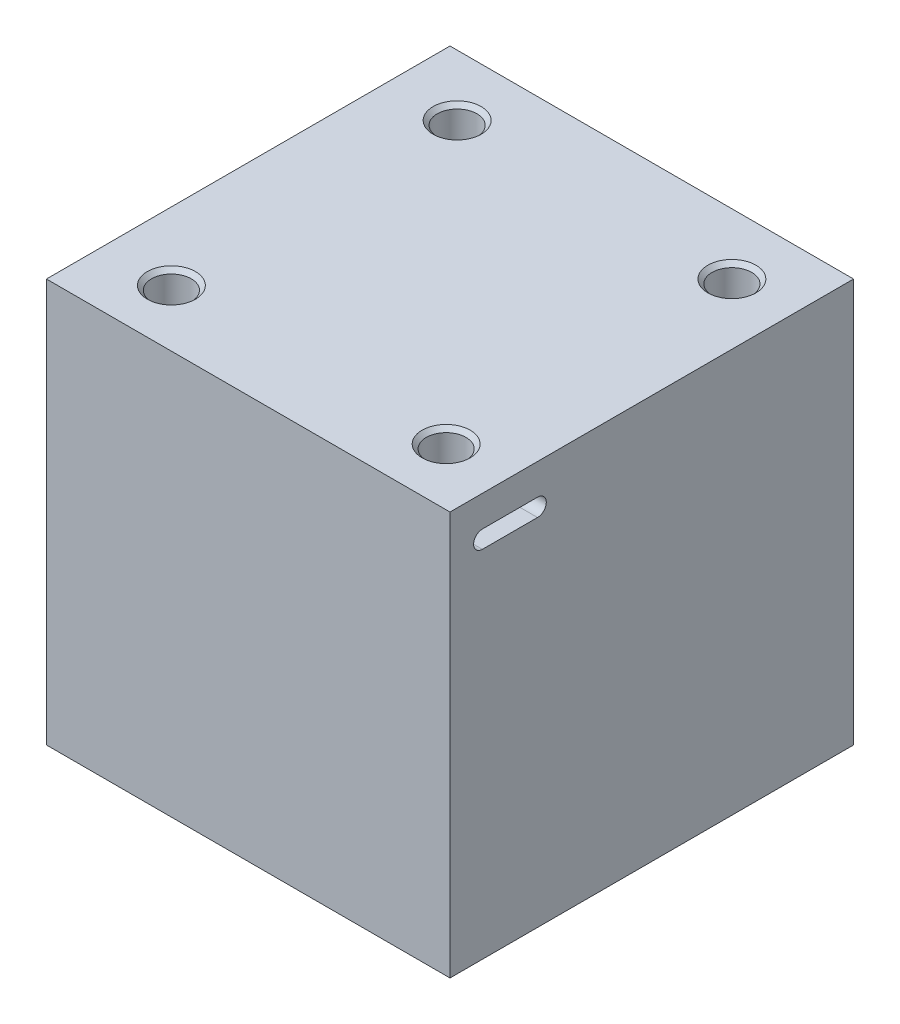
ISO-10303-21;
HEADER;
FILE_DESCRIPTION(('STEP AP214'),'2;1');
FILE_NAME('part.step','',(''),(''),'','','');
FILE_SCHEMA(('AUTOMOTIVE_DESIGN { 1 0 10303 214 1 1 1 1 }'));
ENDSEC;
DATA;
#1=APPLICATION_CONTEXT('core data for automotive mechanical design processes');
#2=APPLICATION_PROTOCOL_DEFINITION('international standard','automotive_design',2000,#1);
#3=PRODUCT_CONTEXT('',#1,'mechanical');
#4=PRODUCT('Part','Part','',(#3));
#5=PRODUCT_RELATED_PRODUCT_CATEGORY('part','',(#4));
#6=PRODUCT_DEFINITION_FORMATION('','',#4);
#7=PRODUCT_DEFINITION_CONTEXT('part definition',#1,'design');
#8=PRODUCT_DEFINITION('design','',#6,#7);
#9=PRODUCT_DEFINITION_SHAPE('','',#8);
#10=(LENGTH_UNIT() NAMED_UNIT(*) SI_UNIT(.MILLI.,.METRE.));
#11=(NAMED_UNIT(*) PLANE_ANGLE_UNIT() SI_UNIT($,.RADIAN.));
#12=(NAMED_UNIT(*) SI_UNIT($,.STERADIAN.) SOLID_ANGLE_UNIT());
#13=UNCERTAINTY_MEASURE_WITH_UNIT(LENGTH_MEASURE(1.E-05),#10,'distance_accuracy_value','');
#14=(GEOMETRIC_REPRESENTATION_CONTEXT(3) GLOBAL_UNCERTAINTY_ASSIGNED_CONTEXT((#13)) GLOBAL_UNIT_ASSIGNED_CONTEXT((#10,
#11,#12)) REPRESENTATION_CONTEXT('',''));
#15=CARTESIAN_POINT('',(0.,0.,0.));
#16=DIRECTION('',(0.,0.,1.));
#17=DIRECTION('',(1.,0.,0.));
#18=AXIS2_PLACEMENT_3D('',#15,#16,#17);
#19=CARTESIAN_POINT('',(-42.2382238853841,50.8,43.6324444897448));
#20=DIRECTION('',(0.,1.,0.));
#21=DIRECTION('',(0.,0.,1.));
#22=AXIS2_PLACEMENT_3D('',#19,#20,#21);
#23=CYLINDRICAL_SURFACE('',#22,2.49999999999999);
#24=CARTESIAN_POINT('',(-42.2382238853841,46.9066280030771,43.6324444897448));
#25=DIRECTION('',(0.,1.,0.));
#26=DIRECTION('',(0.,0.,1.));
#27=AXIS2_PLACEMENT_3D('',#24,#25,#26);
#28=CIRCLE('',#27,2.49999999999999);
#29=CARTESIAN_POINT('',(-42.2382238853841,46.9066280030771,46.1324444897448));
#30=VERTEX_POINT('',#29);
#31=EDGE_CURVE('E154',#30,#30,#28,.T.);
#32=ORIENTED_EDGE('',*,*,#31,.F.);
#33=EDGE_LOOP('',(#32));
#34=FACE_BOUND('',#33,.T.);
#35=CARTESIAN_POINT('',(-42.2382238853841,50.275,43.6324444897448));
#36=DIRECTION('',(0.,1.,0.));
#37=DIRECTION('',(0.,0.,1.));
#38=AXIS2_PLACEMENT_3D('',#35,#36,#37);
#39=CIRCLE('',#38,2.49999999999999);
#40=CARTESIAN_POINT('',(-42.2382238853841,50.275,46.1324444897448));
#41=VERTEX_POINT('',#40);
#42=EDGE_CURVE('E181',#41,#41,#39,.T.);
#43=ORIENTED_EDGE('',*,*,#42,.T.);
#44=EDGE_LOOP('',(#43));
#45=FACE_BOUND('',#44,.T.);
#46=ADVANCED_FACE('F41',(#34,#45),#23,.F.);
#47=CARTESIAN_POINT('',(-7.65257367586586,50.8,43.6324444897448));
#48=DIRECTION('',(0.,1.,0.));
#49=DIRECTION('',(0.,0.,1.));
#50=AXIS2_PLACEMENT_3D('',#47,#48,#49);
#51=CYLINDRICAL_SURFACE('',#50,2.49999999999999);
#52=CARTESIAN_POINT('',(-7.65257367586586,46.9066280030771,43.6324444897448));
#53=DIRECTION('',(0.,1.,0.));
#54=DIRECTION('',(0.,0.,1.));
#55=AXIS2_PLACEMENT_3D('',#52,#53,#54);
#56=CIRCLE('',#55,2.49999999999999);
#57=CARTESIAN_POINT('',(-7.65257367586586,46.9066280030771,46.1324444897448));
#58=VERTEX_POINT('',#57);
#59=EDGE_CURVE('E121',#58,#58,#56,.T.);
#60=ORIENTED_EDGE('',*,*,#59,.F.);
#61=EDGE_LOOP('',(#60));
#62=FACE_BOUND('',#61,.T.);
#63=CARTESIAN_POINT('',(-7.65257367586586,50.275,43.6324444897448));
#64=DIRECTION('',(0.,1.,0.));
#65=DIRECTION('',(0.,0.,1.));
#66=AXIS2_PLACEMENT_3D('',#63,#64,#65);
#67=CIRCLE('',#66,2.49999999999999);
#68=CARTESIAN_POINT('',(-7.65257367586586,50.275,46.1324444897448));
#69=VERTEX_POINT('',#68);
#70=EDGE_CURVE('E172',#69,#69,#67,.T.);
#71=ORIENTED_EDGE('',*,*,#70,.T.);
#72=EDGE_LOOP('',(#71));
#73=FACE_BOUND('',#72,.T.);
#74=ADVANCED_FACE('F237',(#62,#73),#51,.F.);
#75=CARTESIAN_POINT('',(0.,0.,50.8));
#76=DIRECTION('',(-1.,0.,0.));
#77=DIRECTION('',(0.,0.,1.));
#78=AXIS2_PLACEMENT_3D('',#75,#76,#77);
#79=PLANE('',#78);
#80=CARTESIAN_POINT('',(0.,45.8,46.7210328592849));
#81=DIRECTION('',(1.,0.,0.));
#82=DIRECTION('',(0.,0.,-1.));
#83=AXIS2_PLACEMENT_3D('',#80,#81,#82);
#84=CIRCLE('',#83,1.10662800307708);
#85=CARTESIAN_POINT('',(0.,46.9066280030771,46.7210328592849));
#86=VERTEX_POINT('',#85);
#87=CARTESIAN_POINT('',(0.,44.6933719969229,46.7210328592849));
#88=VERTEX_POINT('',#87);
#89=EDGE_CURVE('E56',#86,#88,#84,.T.);
#90=ORIENTED_EDGE('',*,*,#89,.F.);
#91=DIRECTION('',(0.,0.,1.));
#92=VECTOR('',#91,1.);
#93=CARTESIAN_POINT('',(0.,46.9066280030771,46.7210328592849));
#94=LINE('',#93,#92);
#95=CARTESIAN_POINT('',(0.,46.9066280030771,39.786164040002));
#96=VERTEX_POINT('',#95);
#97=EDGE_CURVE('E114',#96,#86,#94,.T.);
#98=ORIENTED_EDGE('',*,*,#97,.F.);
#99=CARTESIAN_POINT('',(0.,45.8,39.786164040002));
#100=DIRECTION('',(1.,0.,0.));
#101=DIRECTION('',(0.,0.,-1.));
#102=AXIS2_PLACEMENT_3D('',#99,#100,#101);
#103=CIRCLE('',#102,1.10662800307708);
#104=CARTESIAN_POINT('',(0.,44.6933719969229,39.786164040002));
#105=VERTEX_POINT('',#104);
#106=EDGE_CURVE('E135',#105,#96,#103,.T.);
#107=ORIENTED_EDGE('',*,*,#106,.F.);
#108=DIRECTION('',(0.,0.,-1.));
#109=VECTOR('',#108,1.);
#110=CARTESIAN_POINT('',(0.,44.6933719969229,46.7210328592849));
#111=LINE('',#110,#109);
#112=EDGE_CURVE('E129',#88,#105,#111,.T.);
#113=ORIENTED_EDGE('',*,*,#112,.F.);
#114=EDGE_LOOP('',(#90,#98,#107,#113));
#115=FACE_BOUND('',#114,.T.);
#116=DIRECTION('',(0.,1.,0.));
#117=VECTOR('',#116,1.);
#118=CARTESIAN_POINT('',(0.,0.,0.));
#119=LINE('',#118,#117);
#120=CARTESIAN_POINT('',(0.,0.,0.));
#121=VERTEX_POINT('',#120);
#122=CARTESIAN_POINT('',(0.,50.8,0.));
#123=VERTEX_POINT('',#122);
#124=EDGE_CURVE('E187',#121,#123,#119,.T.);
#125=ORIENTED_EDGE('',*,*,#124,.T.);
#126=DIRECTION('',(0.,0.,-1.));
#127=VECTOR('',#126,1.);
#128=CARTESIAN_POINT('',(0.,50.8,50.8));
#129=LINE('',#128,#127);
#130=CARTESIAN_POINT('',(0.,50.8,50.8));
#131=VERTEX_POINT('',#130);
#132=EDGE_CURVE('E11',#131,#123,#129,.T.);
#133=ORIENTED_EDGE('',*,*,#132,.F.);
#134=DIRECTION('',(0.,1.,0.));
#135=VECTOR('',#134,1.);
#136=CARTESIAN_POINT('',(0.,0.,50.8));
#137=LINE('',#136,#135);
#138=CARTESIAN_POINT('',(0.,0.,50.8));
#139=VERTEX_POINT('',#138);
#140=EDGE_CURVE('E188',#139,#131,#137,.T.);
#141=ORIENTED_EDGE('',*,*,#140,.F.);
#142=DIRECTION('',(0.,0.,-1.));
#143=VECTOR('',#142,1.);
#144=CARTESIAN_POINT('',(0.,0.,50.8));
#145=LINE('',#144,#143);
#146=EDGE_CURVE('E198',#139,#121,#145,.T.);
#147=ORIENTED_EDGE('',*,*,#146,.T.);
#148=EDGE_LOOP('',(#125,#133,#141,#147));
#149=FACE_BOUND('',#148,.T.);
#150=ADVANCED_FACE('F43',(#115,#149),#79,.F.);
#151=CARTESIAN_POINT('',(0.,50.8,50.8));
#152=DIRECTION('',(0.,-1.,0.));
#153=DIRECTION('',(1.,0.,0.));
#154=AXIS2_PLACEMENT_3D('',#151,#152,#153);
#155=PLANE('',#154);
#156=CARTESIAN_POINT('',(-42.2382238853841,50.8,7.66336827184591));
#157=DIRECTION('',(0.,1.,0.));
#158=DIRECTION('',(0.,0.,1.));
#159=AXIS2_PLACEMENT_3D('',#156,#157,#158);
#160=CIRCLE('',#159,3.025);
#161=CARTESIAN_POINT('',(-42.2382238853841,50.8,10.6883682718459));
#162=VERTEX_POINT('',#161);
#163=EDGE_CURVE('E150',#162,#162,#160,.T.);
#164=ORIENTED_EDGE('',*,*,#163,.F.);
#165=EDGE_LOOP('',(#164));
#166=FACE_BOUND('',#165,.T.);
#167=CARTESIAN_POINT('',(-7.65257367586586,50.8,7.66336827184591));
#168=DIRECTION('',(0.,1.,0.));
#169=DIRECTION('',(0.,0.,1.));
#170=AXIS2_PLACEMENT_3D('',#167,#168,#169);
#171=CIRCLE('',#170,3.025);
#172=CARTESIAN_POINT('',(-7.65257367586586,50.8,10.6883682718459));
#173=VERTEX_POINT('',#172);
#174=EDGE_CURVE('E160',#173,#173,#171,.T.);
#175=ORIENTED_EDGE('',*,*,#174,.F.);
#176=EDGE_LOOP('',(#175));
#177=FACE_BOUND('',#176,.T.);
#178=CARTESIAN_POINT('',(-7.65257367586586,50.8,43.6324444897448));
#179=DIRECTION('',(0.,1.,0.));
#180=DIRECTION('',(0.,0.,1.));
#181=AXIS2_PLACEMENT_3D('',#178,#179,#180);
#182=CIRCLE('',#181,3.025);
#183=CARTESIAN_POINT('',(-7.65257367586586,50.8,46.6574444897448));
#184=VERTEX_POINT('',#183);
#185=EDGE_CURVE('E169',#184,#184,#182,.T.);
#186=ORIENTED_EDGE('',*,*,#185,.F.);
#187=EDGE_LOOP('',(#186));
#188=FACE_BOUND('',#187,.T.);
#189=CARTESIAN_POINT('',(-42.2382238853841,50.8,43.6324444897448));
#190=DIRECTION('',(0.,1.,0.));
#191=DIRECTION('',(0.,0.,1.));
#192=AXIS2_PLACEMENT_3D('',#189,#190,#191);
#193=CIRCLE('',#192,3.025);
#194=CARTESIAN_POINT('',(-42.2382238853841,50.8,46.6574444897448));
#195=VERTEX_POINT('',#194);
#196=EDGE_CURVE('E178',#195,#195,#193,.T.);
#197=ORIENTED_EDGE('',*,*,#196,.F.);
#198=EDGE_LOOP('',(#197));
#199=FACE_BOUND('',#198,.T.);
#200=DIRECTION('',(-1.,0.,0.));
#201=VECTOR('',#200,1.);
#202=CARTESIAN_POINT('',(0.,50.8,0.));
#203=LINE('',#202,#201);
#204=CARTESIAN_POINT('',(-50.8,50.8,0.));
#205=VERTEX_POINT('',#204);
#206=EDGE_CURVE('E201',#123,#205,#203,.T.);
#207=ORIENTED_EDGE('',*,*,#206,.T.);
#208=DIRECTION('',(0.,0.,-1.));
#209=VECTOR('',#208,1.);
#210=CARTESIAN_POINT('',(-50.8,50.8,50.8));
#211=LINE('',#210,#209);
#212=CARTESIAN_POINT('',(-50.8,50.8,50.8));
#213=VERTEX_POINT('',#212);
#214=EDGE_CURVE('E49',#213,#205,#211,.T.);
#215=ORIENTED_EDGE('',*,*,#214,.F.);
#216=DIRECTION('',(-1.,0.,0.));
#217=VECTOR('',#216,1.);
#218=CARTESIAN_POINT('',(0.,50.8,50.8));
#219=LINE('',#218,#217);
#220=EDGE_CURVE('E191',#131,#213,#219,.T.);
#221=ORIENTED_EDGE('',*,*,#220,.F.);
#222=ORIENTED_EDGE('',*,*,#132,.T.);
#223=EDGE_LOOP('',(#207,#215,#221,#222));
#224=FACE_BOUND('',#223,.T.);
#225=ADVANCED_FACE('F229',(#166,#177,#188,#199,#224),#155,.F.);
#226=CARTESIAN_POINT('',(-50.8,0.,50.8));
#227=DIRECTION('',(1.,0.,0.));
#228=DIRECTION('',(0.,0.,-1.));
#229=AXIS2_PLACEMENT_3D('',#226,#227,#228);
#230=PLANE('',#229);
#231=CARTESIAN_POINT('',(-50.8,45.8,39.786164040002));
#232=DIRECTION('',(1.,0.,0.));
#233=DIRECTION('',(0.,0.,-1.));
#234=AXIS2_PLACEMENT_3D('',#231,#232,#233);
#235=CIRCLE('',#234,1.10662800307708);
#236=CARTESIAN_POINT('',(-50.8,46.9066280030771,39.786164040002));
#237=VERTEX_POINT('',#236);
#238=CARTESIAN_POINT('',(-50.8,44.6933719969229,39.786164040002));
#239=VERTEX_POINT('',#238);
#240=EDGE_CURVE('E64',#237,#239,#235,.F.);
#241=ORIENTED_EDGE('',*,*,#240,.F.);
#242=DIRECTION('',(0.,0.,-1.));
#243=VECTOR('',#242,1.);
#244=CARTESIAN_POINT('',(-50.8,46.9066280030771,46.7210328592849));
#245=LINE('',#244,#243);
#246=CARTESIAN_POINT('',(-50.8,46.9066280030771,46.7210328592849));
#247=VERTEX_POINT('',#246);
#248=EDGE_CURVE('E127',#247,#237,#245,.T.);
#249=ORIENTED_EDGE('',*,*,#248,.F.);
#250=CARTESIAN_POINT('',(-50.8,45.8,46.7210328592849));
#251=DIRECTION('',(1.,0.,0.));
#252=DIRECTION('',(0.,0.,-1.));
#253=AXIS2_PLACEMENT_3D('',#250,#251,#252);
#254=CIRCLE('',#253,1.10662800307708);
#255=CARTESIAN_POINT('',(-50.8,44.6933719969229,46.7210328592849));
#256=VERTEX_POINT('',#255);
#257=EDGE_CURVE('E108',#256,#247,#254,.F.);
#258=ORIENTED_EDGE('',*,*,#257,.F.);
#259=DIRECTION('',(0.,0.,1.));
#260=VECTOR('',#259,1.);
#261=CARTESIAN_POINT('',(-50.8,44.6933719969229,46.7210328592849));
#262=LINE('',#261,#260);
#263=EDGE_CURVE('E117',#239,#256,#262,.T.);
#264=ORIENTED_EDGE('',*,*,#263,.F.);
#265=EDGE_LOOP('',(#241,#249,#258,#264));
#266=FACE_BOUND('',#265,.T.);
#267=DIRECTION('',(0.,-1.,0.));
#268=VECTOR('',#267,1.);
#269=CARTESIAN_POINT('',(-50.8,0.,0.));
#270=LINE('',#269,#268);
#271=CARTESIAN_POINT('',(-50.8,0.,0.));
#272=VERTEX_POINT('',#271);
#273=EDGE_CURVE('E203',#205,#272,#270,.T.);
#274=ORIENTED_EDGE('',*,*,#273,.T.);
#275=DIRECTION('',(0.,0.,-1.));
#276=VECTOR('',#275,1.);
#277=CARTESIAN_POINT('',(-50.8,0.,50.8));
#278=LINE('',#277,#276);
#279=CARTESIAN_POINT('',(-50.8,0.,50.8));
#280=VERTEX_POINT('',#279);
#281=EDGE_CURVE('E208',#280,#272,#278,.T.);
#282=ORIENTED_EDGE('',*,*,#281,.F.);
#283=DIRECTION('',(0.,-1.,0.));
#284=VECTOR('',#283,1.);
#285=CARTESIAN_POINT('',(-50.8,0.,50.8));
#286=LINE('',#285,#284);
#287=EDGE_CURVE('E194',#213,#280,#286,.T.);
#288=ORIENTED_EDGE('',*,*,#287,.F.);
#289=ORIENTED_EDGE('',*,*,#214,.T.);
#290=EDGE_LOOP('',(#274,#282,#288,#289));
#291=FACE_BOUND('',#290,.T.);
#292=ADVANCED_FACE('F124',(#266,#291),#230,.F.);
#293=CARTESIAN_POINT('',(0.,0.,50.8));
#294=DIRECTION('',(0.,1.,0.));
#295=DIRECTION('',(-1.,0.,0.));
#296=AXIS2_PLACEMENT_3D('',#293,#294,#295);
#297=PLANE('',#296);
#298=CARTESIAN_POINT('',(-42.2382238853841,0.,7.66336827184591));
#299=DIRECTION('',(0.,1.,0.));
#300=DIRECTION('',(0.,0.,1.));
#301=AXIS2_PLACEMENT_3D('',#298,#299,#300);
#302=CIRCLE('',#301,2.5);
#303=CARTESIAN_POINT('',(-42.2382238853841,0.,10.1633682718459));
#304=VERTEX_POINT('',#303);
#305=EDGE_CURVE('E157',#304,#304,#302,.T.);
#306=ORIENTED_EDGE('',*,*,#305,.T.);
#307=EDGE_LOOP('',(#306));
#308=FACE_BOUND('',#307,.T.);
#309=CARTESIAN_POINT('',(-7.65257367586586,0.,7.66336827184591));
#310=DIRECTION('',(0.,1.,0.));
#311=DIRECTION('',(0.,0.,1.));
#312=AXIS2_PLACEMENT_3D('',#309,#310,#311);
#313=CIRCLE('',#312,2.49999999999999);
#314=CARTESIAN_POINT('',(-7.65257367586586,0.,10.1633682718459));
#315=VERTEX_POINT('',#314);
#316=EDGE_CURVE('E166',#315,#315,#313,.T.);
#317=ORIENTED_EDGE('',*,*,#316,.T.);
#318=EDGE_LOOP('',(#317));
#319=FACE_BOUND('',#318,.T.);
#320=CARTESIAN_POINT('',(-7.65257367586586,0.,43.6324444897448));
#321=DIRECTION('',(0.,1.,0.));
#322=DIRECTION('',(0.,0.,1.));
#323=AXIS2_PLACEMENT_3D('',#320,#321,#322);
#324=CIRCLE('',#323,2.49999999999999);
#325=CARTESIAN_POINT('',(-7.65257367586586,0.,46.1324444897448));
#326=VERTEX_POINT('',#325);
#327=EDGE_CURVE('E175',#326,#326,#324,.T.);
#328=ORIENTED_EDGE('',*,*,#327,.T.);
#329=EDGE_LOOP('',(#328));
#330=FACE_BOUND('',#329,.T.);
#331=CARTESIAN_POINT('',(-42.2382238853841,0.,43.6324444897448));
#332=DIRECTION('',(0.,1.,0.));
#333=DIRECTION('',(0.,0.,1.));
#334=AXIS2_PLACEMENT_3D('',#331,#332,#333);
#335=CIRCLE('',#334,2.5);
#336=CARTESIAN_POINT('',(-42.2382238853841,0.,46.1324444897448));
#337=VERTEX_POINT('',#336);
#338=EDGE_CURVE('E184',#337,#337,#335,.T.);
#339=ORIENTED_EDGE('',*,*,#338,.T.);
#340=EDGE_LOOP('',(#339));
#341=FACE_BOUND('',#340,.T.);
#342=DIRECTION('',(1.,0.,0.));
#343=VECTOR('',#342,1.);
#344=CARTESIAN_POINT('',(0.,0.,0.));
#345=LINE('',#344,#343);
#346=EDGE_CURVE('E192',#272,#121,#345,.T.);
#347=ORIENTED_EDGE('',*,*,#346,.T.);
#348=ORIENTED_EDGE('',*,*,#146,.F.);
#349=DIRECTION('',(1.,0.,0.));
#350=VECTOR('',#349,1.);
#351=CARTESIAN_POINT('',(0.,0.,50.8));
#352=LINE('',#351,#350);
#353=EDGE_CURVE('E196',#280,#139,#352,.T.);
#354=ORIENTED_EDGE('',*,*,#353,.F.);
#355=ORIENTED_EDGE('',*,*,#281,.T.);
#356=EDGE_LOOP('',(#347,#348,#354,#355));
#357=FACE_BOUND('',#356,.T.);
#358=ADVANCED_FACE('F222',(#308,#319,#330,#341,#357),#297,.F.);
#359=CARTESIAN_POINT('',(0.,0.,50.8));
#360=DIRECTION('',(0.,0.,1.));
#361=DIRECTION('',(1.,0.,0.));
#362=AXIS2_PLACEMENT_3D('',#359,#360,#361);
#363=PLANE('',#362);
#364=ORIENTED_EDGE('',*,*,#140,.T.);
#365=ORIENTED_EDGE('',*,*,#220,.T.);
#366=ORIENTED_EDGE('',*,*,#287,.T.);
#367=ORIENTED_EDGE('',*,*,#353,.T.);
#368=EDGE_LOOP('',(#364,#365,#366,#367));
#369=FACE_BOUND('',#368,.T.);
#370=ADVANCED_FACE('F228',(#369),#363,.T.);
#371=CARTESIAN_POINT('',(0.,0.,0.));
#372=DIRECTION('',(0.,0.,1.));
#373=DIRECTION('',(1.,0.,0.));
#374=AXIS2_PLACEMENT_3D('',#371,#372,#373);
#375=PLANE('',#374);
#376=ORIENTED_EDGE('',*,*,#124,.F.);
#377=ORIENTED_EDGE('',*,*,#346,.F.);
#378=ORIENTED_EDGE('',*,*,#273,.F.);
#379=ORIENTED_EDGE('',*,*,#206,.F.);
#380=EDGE_LOOP('',(#376,#377,#378,#379));
#381=FACE_BOUND('',#380,.T.);
#382=ADVANCED_FACE('F219',(#381),#375,.F.);
#383=CARTESIAN_POINT('',(-42.2382238853841,44.6933719969229,43.6324444897448));
#384=DIRECTION('',(0.,-1.,0.));
#385=DIRECTION('',(0.,0.,-1.));
#386=AXIS2_PLACEMENT_3D('',#383,#384,#385);
#387=CIRCLE('',#386,2.49999999999999);
#388=CARTESIAN_POINT('',(-42.2382238853841,44.6933719969229,41.1324444897448));
#389=VERTEX_POINT('',#388);
#390=EDGE_CURVE('E122',#389,#389,#387,.T.);
#391=ORIENTED_EDGE('',*,*,#390,.F.);
#392=EDGE_LOOP('',(#391));
#393=FACE_BOUND('',#392,.T.);
#394=ORIENTED_EDGE('',*,*,#338,.F.);
#395=EDGE_LOOP('',(#394));
#396=FACE_BOUND('',#395,.T.);
#397=ADVANCED_FACE('F244',(#393,#396),#23,.F.);
#398=CARTESIAN_POINT('',(-42.2382238853841,50.8,43.6324444897448));
#399=DIRECTION('',(0.,1.,0.));
#400=DIRECTION('',(0.,0.,1.));
#401=AXIS2_PLACEMENT_3D('',#398,#399,#400);
#402=CONICAL_SURFACE('',#401,3.025,0.785398163397435);
#403=ORIENTED_EDGE('',*,*,#42,.F.);
#404=EDGE_LOOP('',(#403));
#405=FACE_BOUND('',#404,.T.);
#406=ORIENTED_EDGE('',*,*,#196,.T.);
#407=EDGE_LOOP('',(#406));
#408=FACE_BOUND('',#407,.T.);
#409=ADVANCED_FACE('F256',(#405,#408),#402,.F.);
#410=CARTESIAN_POINT('',(-7.65257367586586,44.6933719969229,43.6324444897448));
#411=DIRECTION('',(0.,-1.,0.));
#412=DIRECTION('',(0.,0.,-1.));
#413=AXIS2_PLACEMENT_3D('',#410,#411,#412);
#414=CIRCLE('',#413,2.49999999999999);
#415=CARTESIAN_POINT('',(-7.65257367586586,44.6933719969229,41.1324444897448));
#416=VERTEX_POINT('',#415);
#417=EDGE_CURVE('E142',#416,#416,#414,.T.);
#418=ORIENTED_EDGE('',*,*,#417,.F.);
#419=EDGE_LOOP('',(#418));
#420=FACE_BOUND('',#419,.T.);
#421=ORIENTED_EDGE('',*,*,#327,.F.);
#422=EDGE_LOOP('',(#421));
#423=FACE_BOUND('',#422,.T.);
#424=ADVANCED_FACE('F250',(#420,#423),#51,.F.);
#425=CARTESIAN_POINT('',(-7.65257367586586,50.8,43.6324444897448));
#426=DIRECTION('',(0.,1.,0.));
#427=DIRECTION('',(0.,0.,1.));
#428=AXIS2_PLACEMENT_3D('',#425,#426,#427);
#429=CONICAL_SURFACE('',#428,3.025,0.785398163397435);
#430=ORIENTED_EDGE('',*,*,#70,.F.);
#431=EDGE_LOOP('',(#430));
#432=FACE_BOUND('',#431,.T.);
#433=ORIENTED_EDGE('',*,*,#185,.T.);
#434=EDGE_LOOP('',(#433));
#435=FACE_BOUND('',#434,.T.);
#436=ADVANCED_FACE('F281',(#432,#435),#429,.F.);
#437=CARTESIAN_POINT('',(-7.65257367586586,50.8,7.66336827184591));
#438=DIRECTION('',(0.,1.,0.));
#439=DIRECTION('',(0.,0.,1.));
#440=AXIS2_PLACEMENT_3D('',#437,#438,#439);
#441=CYLINDRICAL_SURFACE('',#440,2.49999999999999);
#442=ORIENTED_EDGE('',*,*,#316,.F.);
#443=EDGE_LOOP('',(#442));
#444=FACE_BOUND('',#443,.T.);
#445=CARTESIAN_POINT('',(-7.65257367586586,50.275,7.66336827184591));
#446=DIRECTION('',(0.,1.,0.));
#447=DIRECTION('',(0.,0.,1.));
#448=AXIS2_PLACEMENT_3D('',#445,#446,#447);
#449=CIRCLE('',#448,2.49999999999999);
#450=CARTESIAN_POINT('',(-7.65257367586586,50.275,10.1633682718459));
#451=VERTEX_POINT('',#450);
#452=EDGE_CURVE('E163',#451,#451,#449,.T.);
#453=ORIENTED_EDGE('',*,*,#452,.T.);
#454=EDGE_LOOP('',(#453));
#455=FACE_BOUND('',#454,.T.);
#456=ADVANCED_FACE('F286',(#444,#455),#441,.F.);
#457=CARTESIAN_POINT('',(-7.65257367586586,50.8,7.66336827184591));
#458=DIRECTION('',(0.,1.,0.));
#459=DIRECTION('',(0.,0.,1.));
#460=AXIS2_PLACEMENT_3D('',#457,#458,#459);
#461=CONICAL_SURFACE('',#460,3.025,0.785398163397435);
#462=ORIENTED_EDGE('',*,*,#452,.F.);
#463=EDGE_LOOP('',(#462));
#464=FACE_BOUND('',#463,.T.);
#465=ORIENTED_EDGE('',*,*,#174,.T.);
#466=EDGE_LOOP('',(#465));
#467=FACE_BOUND('',#466,.T.);
#468=ADVANCED_FACE('F293',(#464,#467),#461,.F.);
#469=CARTESIAN_POINT('',(-42.2382238853841,50.8,7.66336827184591));
#470=DIRECTION('',(0.,1.,0.));
#471=DIRECTION('',(0.,0.,1.));
#472=AXIS2_PLACEMENT_3D('',#469,#470,#471);
#473=CYLINDRICAL_SURFACE('',#472,2.49999999999999);
#474=ORIENTED_EDGE('',*,*,#305,.F.);
#475=EDGE_LOOP('',(#474));
#476=FACE_BOUND('',#475,.T.);
#477=CARTESIAN_POINT('',(-42.2382238853841,50.275,7.66336827184591));
#478=DIRECTION('',(0.,1.,0.));
#479=DIRECTION('',(0.,0.,1.));
#480=AXIS2_PLACEMENT_3D('',#477,#478,#479);
#481=CIRCLE('',#480,2.49999999999999);
#482=CARTESIAN_POINT('',(-42.2382238853841,50.275,10.1633682718459));
#483=VERTEX_POINT('',#482);
#484=EDGE_CURVE('E153',#483,#483,#481,.T.);
#485=ORIENTED_EDGE('',*,*,#484,.T.);
#486=EDGE_LOOP('',(#485));
#487=FACE_BOUND('',#486,.T.);
#488=ADVANCED_FACE('F297',(#476,#487),#473,.F.);
#489=CARTESIAN_POINT('',(-42.2382238853841,50.8,7.66336827184591));
#490=DIRECTION('',(0.,1.,0.));
#491=DIRECTION('',(0.,0.,1.));
#492=AXIS2_PLACEMENT_3D('',#489,#490,#491);
#493=CONICAL_SURFACE('',#492,3.025,0.785398163397435);
#494=ORIENTED_EDGE('',*,*,#484,.F.);
#495=EDGE_LOOP('',(#494));
#496=FACE_BOUND('',#495,.T.);
#497=ORIENTED_EDGE('',*,*,#163,.T.);
#498=EDGE_LOOP('',(#497));
#499=FACE_BOUND('',#498,.T.);
#500=ADVANCED_FACE('F301',(#496,#499),#493,.F.);
#501=CARTESIAN_POINT('',(-50.801,45.8,46.7210328592849));
#502=DIRECTION('',(1.,0.,0.));
#503=DIRECTION('',(0.,0.,-1.));
#504=AXIS2_PLACEMENT_3D('',#501,#502,#503);
#505=CYLINDRICAL_SURFACE('',#504,1.10662800307708);
#506=ORIENTED_EDGE('',*,*,#257,.T.);
#507=DIRECTION('',(1.,0.,0.));
#508=VECTOR('',#507,1.);
#509=CARTESIAN_POINT('',(-50.801,46.9066280030771,46.7210328592849));
#510=LINE('',#509,#508);
#511=EDGE_CURVE('E140',#247,#86,#510,.T.);
#512=ORIENTED_EDGE('',*,*,#511,.T.);
#513=ORIENTED_EDGE('',*,*,#89,.T.);
#514=DIRECTION('',(1.,0.,0.));
#515=VECTOR('',#514,1.);
#516=CARTESIAN_POINT('',(-50.801,44.6933719969229,46.7210328592849));
#517=LINE('',#516,#515);
#518=EDGE_CURVE('E104',#256,#88,#517,.T.);
#519=ORIENTED_EDGE('',*,*,#518,.F.);
#520=EDGE_LOOP('',(#506,#512,#513,#519));
#521=FACE_BOUND('',#520,.T.);
#522=ADVANCED_FACE('F106',(#521),#505,.F.);
#523=CARTESIAN_POINT('',(-50.801,45.8,39.786164040002));
#524=DIRECTION('',(1.,0.,0.));
#525=DIRECTION('',(0.,0.,-1.));
#526=AXIS2_PLACEMENT_3D('',#523,#524,#525);
#527=CYLINDRICAL_SURFACE('',#526,1.10662800307708);
#528=ORIENTED_EDGE('',*,*,#240,.T.);
#529=DIRECTION('',(1.,0.,0.));
#530=VECTOR('',#529,1.);
#531=CARTESIAN_POINT('',(-50.801,44.6933719969229,39.786164040002));
#532=LINE('',#531,#530);
#533=EDGE_CURVE('E113',#239,#105,#532,.T.);
#534=ORIENTED_EDGE('',*,*,#533,.T.);
#535=ORIENTED_EDGE('',*,*,#106,.T.);
#536=DIRECTION('',(1.,0.,0.));
#537=VECTOR('',#536,1.);
#538=CARTESIAN_POINT('',(-50.801,46.9066280030771,39.786164040002));
#539=LINE('',#538,#537);
#540=EDGE_CURVE('E143',#237,#96,#539,.T.);
#541=ORIENTED_EDGE('',*,*,#540,.F.);
#542=EDGE_LOOP('',(#528,#534,#535,#541));
#543=FACE_BOUND('',#542,.T.);
#544=ADVANCED_FACE('F308',(#543),#527,.F.);
#545=CARTESIAN_POINT('',(-50.801,46.9066280030771,46.7210328592849));
#546=DIRECTION('',(0.,1.,0.));
#547=DIRECTION('',(0.,0.,1.));
#548=AXIS2_PLACEMENT_3D('',#545,#546,#547);
#549=PLANE('',#548);
#550=ORIENTED_EDGE('',*,*,#248,.T.);
#551=ORIENTED_EDGE('',*,*,#540,.T.);
#552=ORIENTED_EDGE('',*,*,#97,.T.);
#553=ORIENTED_EDGE('',*,*,#511,.F.);
#554=EDGE_LOOP('',(#550,#551,#552,#553));
#555=FACE_BOUND('',#554,.T.);
#556=ORIENTED_EDGE('',*,*,#31,.T.);
#557=EDGE_LOOP('',(#556));
#558=FACE_BOUND('',#557,.T.);
#559=ORIENTED_EDGE('',*,*,#59,.T.);
#560=EDGE_LOOP('',(#559));
#561=FACE_BOUND('',#560,.T.);
#562=ADVANCED_FACE('F311',(#555,#558,#561),#549,.F.);
#563=CARTESIAN_POINT('',(-50.801,44.6933719969229,46.7210328592849));
#564=DIRECTION('',(0.,-1.,0.));
#565=DIRECTION('',(0.,0.,-1.));
#566=AXIS2_PLACEMENT_3D('',#563,#564,#565);
#567=PLANE('',#566);
#568=ORIENTED_EDGE('',*,*,#263,.T.);
#569=ORIENTED_EDGE('',*,*,#518,.T.);
#570=ORIENTED_EDGE('',*,*,#112,.T.);
#571=ORIENTED_EDGE('',*,*,#533,.F.);
#572=EDGE_LOOP('',(#568,#569,#570,#571));
#573=FACE_BOUND('',#572,.T.);
#574=ORIENTED_EDGE('',*,*,#390,.T.);
#575=EDGE_LOOP('',(#574));
#576=FACE_BOUND('',#575,.T.);
#577=ORIENTED_EDGE('',*,*,#417,.T.);
#578=EDGE_LOOP('',(#577));
#579=FACE_BOUND('',#578,.T.);
#580=ADVANCED_FACE('F118',(#573,#576,#579),#567,.F.);
#581=CLOSED_SHELL('',(#46,#74,#150,#225,#292,#358,#370,#382,#397,#409,#424,#436,#456,#468,#488,
#500,#522,#544,#562,#580));
#582=MANIFOLD_SOLID_BREP('B2',#581);
#583=ADVANCED_BREP_SHAPE_REPRESENTATION('',(#18,#582),#14);
#584=SHAPE_DEFINITION_REPRESENTATION(#9,#583);
ENDSEC;
END-ISO-10303-21;
